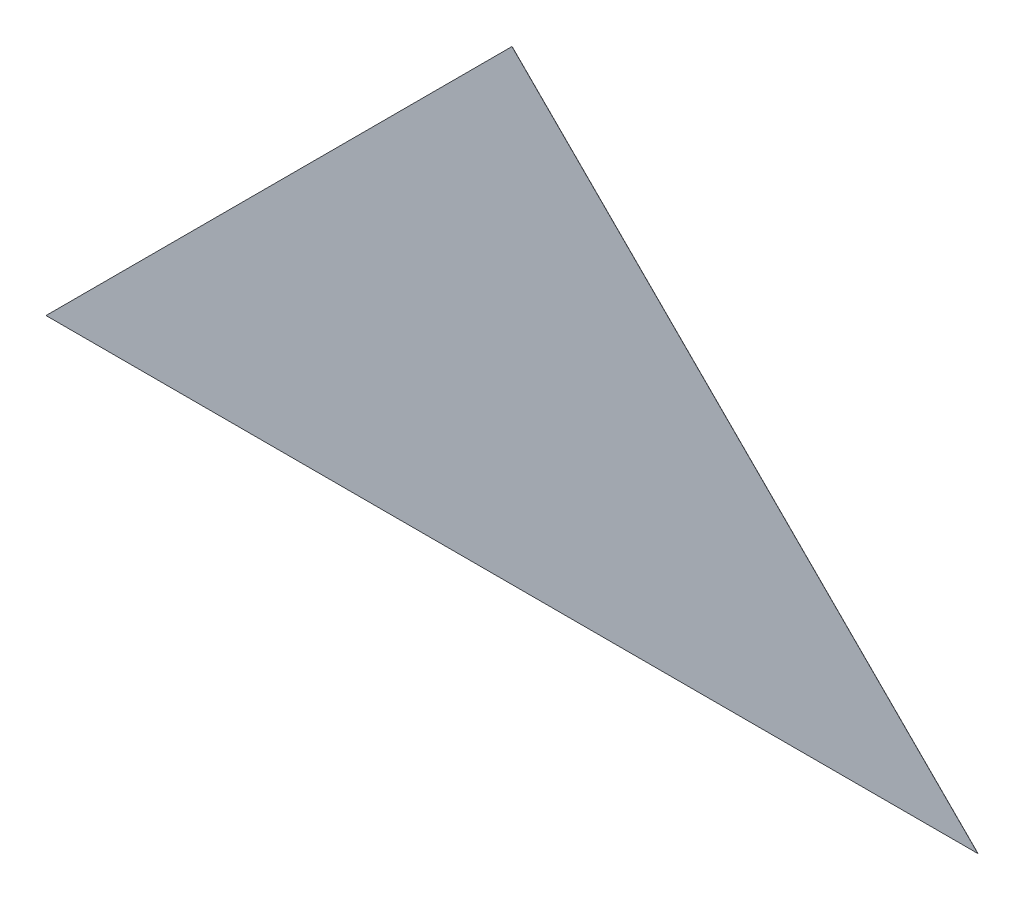
ISO-10303-21;
HEADER;
FILE_DESCRIPTION(('STEP AP214'),'2;1');
FILE_NAME('part.step','',(''),(''),'','','');
FILE_SCHEMA(('AUTOMOTIVE_DESIGN { 1 0 10303 214 1 1 1 1 }'));
ENDSEC;
DATA;
#1=APPLICATION_CONTEXT('core data for automotive mechanical design processes');
#2=APPLICATION_PROTOCOL_DEFINITION('international standard','automotive_design',2000,#1);
#3=PRODUCT_CONTEXT('',#1,'mechanical');
#4=PRODUCT('Part','Part','',(#3));
#5=PRODUCT_RELATED_PRODUCT_CATEGORY('part','',(#4));
#6=PRODUCT_DEFINITION_FORMATION('','',#4);
#7=PRODUCT_DEFINITION_CONTEXT('part definition',#1,'design');
#8=PRODUCT_DEFINITION('design','',#6,#7);
#9=PRODUCT_DEFINITION_SHAPE('','',#8);
#10=(LENGTH_UNIT() NAMED_UNIT(*) SI_UNIT(.MILLI.,.METRE.));
#11=(NAMED_UNIT(*) PLANE_ANGLE_UNIT() SI_UNIT($,.RADIAN.));
#12=(NAMED_UNIT(*) SI_UNIT($,.STERADIAN.) SOLID_ANGLE_UNIT());
#13=UNCERTAINTY_MEASURE_WITH_UNIT(LENGTH_MEASURE(1.E-05),#10,'distance_accuracy_value','');
#14=(GEOMETRIC_REPRESENTATION_CONTEXT(3) GLOBAL_UNCERTAINTY_ASSIGNED_CONTEXT((#13)) GLOBAL_UNIT_ASSIGNED_CONTEXT((#10,
#11,#12)) REPRESENTATION_CONTEXT('',''));
#15=CARTESIAN_POINT('',(0.,0.,0.));
#16=DIRECTION('',(0.,0.,1.));
#17=DIRECTION('',(1.,0.,0.));
#18=AXIS2_PLACEMENT_3D('',#15,#16,#17);
#19=CARTESIAN_POINT('',(32.5,32.5,0.01));
#20=DIRECTION('',(0.707106781186548,-0.707106781186547,0.));
#21=DIRECTION('',(0.707106781186547,0.707106781186548,0.));
#22=AXIS2_PLACEMENT_3D('',#19,#20,#21);
#23=PLANE('',#22);
#24=DIRECTION('',(-0.707106781186547,-0.707106781186548,0.));
#25=VECTOR('',#24,1.);
#26=CARTESIAN_POINT('',(32.5,32.5,0.));
#27=LINE('',#26,#25);
#28=CARTESIAN_POINT('',(32.5,32.5,0.));
#29=VERTEX_POINT('',#28);
#30=CARTESIAN_POINT('',(0.,0.,0.));
#31=VERTEX_POINT('',#30);
#32=EDGE_CURVE('E82',#29,#31,#27,.T.);
#33=ORIENTED_EDGE('',*,*,#32,.T.);
#34=DIRECTION('',(0.,0.,-1.));
#35=VECTOR('',#34,1.);
#36=CARTESIAN_POINT('',(0.,0.,0.01));
#37=LINE('',#36,#35);
#38=CARTESIAN_POINT('',(0.,0.,0.01));
#39=VERTEX_POINT('',#38);
#40=EDGE_CURVE('E11',#39,#31,#37,.T.);
#41=ORIENTED_EDGE('',*,*,#40,.F.);
#42=DIRECTION('',(-0.707106781186547,-0.707106781186548,0.));
#43=VECTOR('',#42,1.);
#44=CARTESIAN_POINT('',(32.5,32.5,0.01));
#45=LINE('',#44,#43);
#46=CARTESIAN_POINT('',(32.5,32.5,0.01));
#47=VERTEX_POINT('',#46);
#48=EDGE_CURVE('E75',#47,#39,#45,.T.);
#49=ORIENTED_EDGE('',*,*,#48,.F.);
#50=DIRECTION('',(0.,0.,-1.));
#51=VECTOR('',#50,1.);
#52=CARTESIAN_POINT('',(32.5,32.5,0.01));
#53=LINE('',#52,#51);
#54=EDGE_CURVE('E83',#47,#29,#53,.T.);
#55=ORIENTED_EDGE('',*,*,#54,.T.);
#56=EDGE_LOOP('',(#33,#41,#49,#55));
#57=FACE_BOUND('',#56,.T.);
#58=ADVANCED_FACE('F35',(#57),#23,.F.);
#59=CARTESIAN_POINT('',(0.,0.,0.01));
#60=DIRECTION('',(0.,1.,0.));
#61=DIRECTION('',(0.,0.,1.));
#62=AXIS2_PLACEMENT_3D('',#59,#60,#61);
#63=PLANE('',#62);
#64=DIRECTION('',(1.,0.,0.));
#65=VECTOR('',#64,1.);
#66=CARTESIAN_POINT('',(0.,0.,0.));
#67=LINE('',#66,#65);
#68=CARTESIAN_POINT('',(65.,0.,0.));
#69=VERTEX_POINT('',#68);
#70=EDGE_CURVE('E63',#31,#69,#67,.T.);
#71=ORIENTED_EDGE('',*,*,#70,.T.);
#72=DIRECTION('',(0.,0.,-1.));
#73=VECTOR('',#72,1.);
#74=CARTESIAN_POINT('',(65.,0.,0.01));
#75=LINE('',#74,#73);
#76=CARTESIAN_POINT('',(65.,0.,0.01));
#77=VERTEX_POINT('',#76);
#78=EDGE_CURVE('E43',#77,#69,#75,.T.);
#79=ORIENTED_EDGE('',*,*,#78,.F.);
#80=DIRECTION('',(1.,0.,0.));
#81=VECTOR('',#80,1.);
#82=CARTESIAN_POINT('',(0.,0.,0.01));
#83=LINE('',#82,#81);
#84=EDGE_CURVE('E71',#39,#77,#83,.T.);
#85=ORIENTED_EDGE('',*,*,#84,.F.);
#86=ORIENTED_EDGE('',*,*,#40,.T.);
#87=EDGE_LOOP('',(#71,#79,#85,#86));
#88=FACE_BOUND('',#87,.T.);
#89=ADVANCED_FACE('F72',(#88),#63,.F.);
#90=CARTESIAN_POINT('',(65.,0.,0.01));
#91=DIRECTION('',(-0.707106781186547,-0.707106781186548,0.));
#92=DIRECTION('',(0.707106781186548,-0.707106781186547,0.));
#93=AXIS2_PLACEMENT_3D('',#90,#91,#92);
#94=PLANE('',#93);
#95=DIRECTION('',(-0.707106781186547,0.707106781186547,0.));
#96=VECTOR('',#95,1.);
#97=CARTESIAN_POINT('',(65.,0.,0.));
#98=LINE('',#97,#96);
#99=EDGE_CURVE('E68',#69,#29,#98,.T.);
#100=ORIENTED_EDGE('',*,*,#99,.T.);
#101=ORIENTED_EDGE('',*,*,#54,.F.);
#102=DIRECTION('',(-0.707106781186547,0.707106781186547,0.));
#103=VECTOR('',#102,1.);
#104=CARTESIAN_POINT('',(65.,0.,0.01));
#105=LINE('',#104,#103);
#106=EDGE_CURVE('E51',#77,#47,#105,.T.);
#107=ORIENTED_EDGE('',*,*,#106,.F.);
#108=ORIENTED_EDGE('',*,*,#78,.T.);
#109=EDGE_LOOP('',(#100,#101,#107,#108));
#110=FACE_BOUND('',#109,.T.);
#111=ADVANCED_FACE('F90',(#110),#94,.F.);
#112=CARTESIAN_POINT('',(0.,0.,0.01));
#113=DIRECTION('',(0.,0.,-1.));
#114=DIRECTION('',(-1.,0.,0.));
#115=AXIS2_PLACEMENT_3D('',#112,#113,#114);
#116=PLANE('',#115);
#117=ORIENTED_EDGE('',*,*,#48,.T.);
#118=ORIENTED_EDGE('',*,*,#84,.T.);
#119=ORIENTED_EDGE('',*,*,#106,.T.);
#120=EDGE_LOOP('',(#117,#118,#119));
#121=FACE_BOUND('',#120,.T.);
#122=ADVANCED_FACE('F78',(#121),#116,.F.);
#123=CARTESIAN_POINT('',(0.,0.,0.));
#124=DIRECTION('',(0.,0.,-1.));
#125=DIRECTION('',(-1.,0.,0.));
#126=AXIS2_PLACEMENT_3D('',#123,#124,#125);
#127=PLANE('',#126);
#128=ORIENTED_EDGE('',*,*,#32,.F.);
#129=ORIENTED_EDGE('',*,*,#99,.F.);
#130=ORIENTED_EDGE('',*,*,#70,.F.);
#131=EDGE_LOOP('',(#128,#129,#130));
#132=FACE_BOUND('',#131,.T.);
#133=ADVANCED_FACE('F91',(#132),#127,.T.);
#134=CLOSED_SHELL('',(#58,#89,#111,#122,#133));
#135=MANIFOLD_SOLID_BREP('B2',#134);
#136=ADVANCED_BREP_SHAPE_REPRESENTATION('',(#18,#135),#14);
#137=SHAPE_DEFINITION_REPRESENTATION(#9,#136);
ENDSEC;
END-ISO-10303-21;
